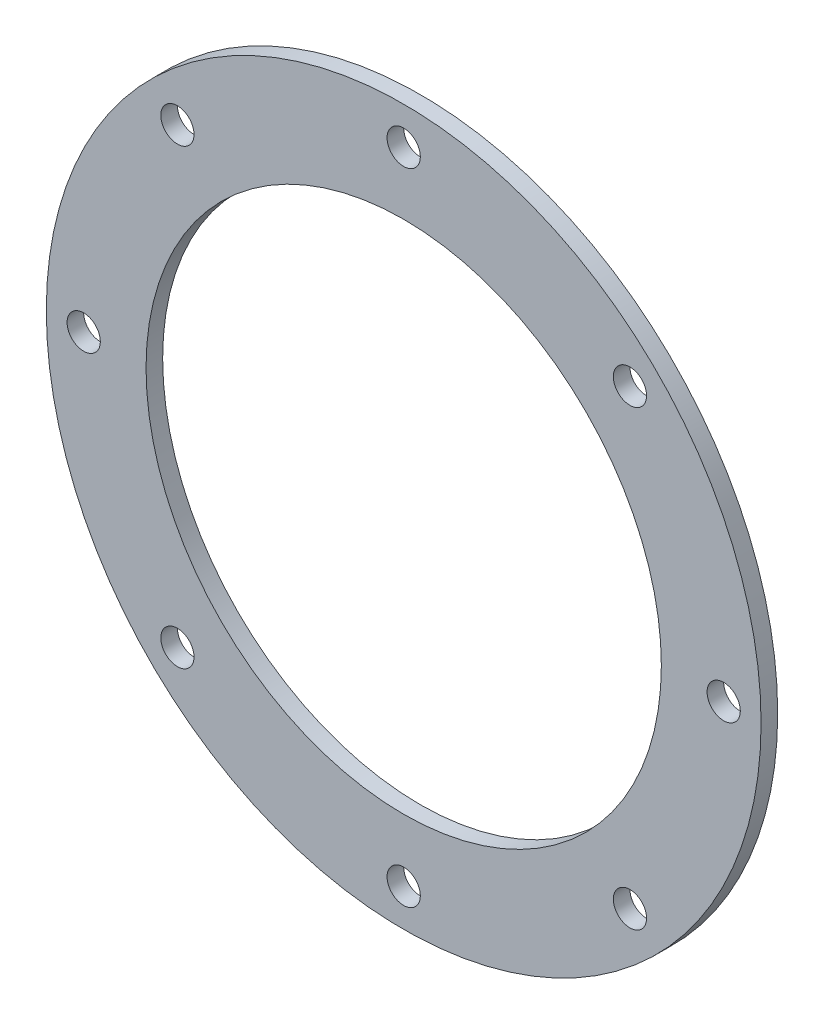
ISO-10303-21;
HEADER;
FILE_DESCRIPTION(('STEP AP214'),'2;1');
FILE_NAME('part.step','',(''),(''),'','','');
FILE_SCHEMA(('AUTOMOTIVE_DESIGN { 1 0 10303 214 1 1 1 1 }'));
ENDSEC;
DATA;
#1=APPLICATION_CONTEXT('core data for automotive mechanical design processes');
#2=APPLICATION_PROTOCOL_DEFINITION('international standard','automotive_design',2000,#1);
#3=PRODUCT_CONTEXT('',#1,'mechanical');
#4=PRODUCT('Part','Part','',(#3));
#5=PRODUCT_RELATED_PRODUCT_CATEGORY('part','',(#4));
#6=PRODUCT_DEFINITION_FORMATION('','',#4);
#7=PRODUCT_DEFINITION_CONTEXT('part definition',#1,'design');
#8=PRODUCT_DEFINITION('design','',#6,#7);
#9=PRODUCT_DEFINITION_SHAPE('','',#8);
#10=(LENGTH_UNIT() NAMED_UNIT(*) SI_UNIT(.MILLI.,.METRE.));
#11=(NAMED_UNIT(*) PLANE_ANGLE_UNIT() SI_UNIT($,.RADIAN.));
#12=(NAMED_UNIT(*) SI_UNIT($,.STERADIAN.) SOLID_ANGLE_UNIT());
#13=UNCERTAINTY_MEASURE_WITH_UNIT(LENGTH_MEASURE(1.E-05),#10,'distance_accuracy_value','');
#14=(GEOMETRIC_REPRESENTATION_CONTEXT(3) GLOBAL_UNCERTAINTY_ASSIGNED_CONTEXT((#13)) GLOBAL_UNIT_ASSIGNED_CONTEXT((#10,
#11,#12)) REPRESENTATION_CONTEXT('',''));
#15=CARTESIAN_POINT('',(0.,0.,0.));
#16=DIRECTION('',(0.,0.,1.));
#17=DIRECTION('',(1.,0.,0.));
#18=AXIS2_PLACEMENT_3D('',#15,#16,#17);
#19=CARTESIAN_POINT('',(0.,38.5,1.));
#20=DIRECTION('',(0.,0.,-1.));
#21=DIRECTION('',(-1.,0.,0.));
#22=AXIS2_PLACEMENT_3D('',#19,#20,#21);
#23=CYLINDRICAL_SURFACE('',#22,2.);
#24=CARTESIAN_POINT('',(0.,38.5,1.));
#25=DIRECTION('',(0.,0.,1.));
#26=DIRECTION('',(1.,0.,0.));
#27=AXIS2_PLACEMENT_3D('',#24,#25,#26);
#28=CIRCLE('',#27,2.);
#29=CARTESIAN_POINT('',(2.,38.5,1.));
#30=VERTEX_POINT('',#29);
#31=EDGE_CURVE('E49',#30,#30,#28,.T.);
#32=ORIENTED_EDGE('',*,*,#31,.T.);
#33=EDGE_LOOP('',(#32));
#34=FACE_BOUND('',#33,.T.);
#35=CARTESIAN_POINT('',(0.,38.5,-1.));
#36=DIRECTION('',(0.,0.,1.));
#37=DIRECTION('',(1.,0.,0.));
#38=AXIS2_PLACEMENT_3D('',#35,#36,#37);
#39=CIRCLE('',#38,2.);
#40=CARTESIAN_POINT('',(2.,38.5,-1.));
#41=VERTEX_POINT('',#40);
#42=EDGE_CURVE('E90',#41,#41,#39,.T.);
#43=ORIENTED_EDGE('',*,*,#42,.F.);
#44=EDGE_LOOP('',(#43));
#45=FACE_BOUND('',#44,.T.);
#46=ADVANCED_FACE('F40',(#34,#45),#23,.F.);
#47=CARTESIAN_POINT('',(27.2236110756821,27.2236110756821,1.));
#48=DIRECTION('',(0.,0.,-1.));
#49=DIRECTION('',(-1.,0.,0.));
#50=AXIS2_PLACEMENT_3D('',#47,#48,#49);
#51=CYLINDRICAL_SURFACE('',#50,2.);
#52=CARTESIAN_POINT('',(27.2236110756821,27.2236110756821,1.));
#53=DIRECTION('',(0.,0.,1.));
#54=DIRECTION('',(1.,0.,0.));
#55=AXIS2_PLACEMENT_3D('',#52,#53,#54);
#56=CIRCLE('',#55,2.);
#57=CARTESIAN_POINT('',(29.2236110756821,27.2236110756821,1.));
#58=VERTEX_POINT('',#57);
#59=EDGE_CURVE('E55',#58,#58,#56,.T.);
#60=ORIENTED_EDGE('',*,*,#59,.T.);
#61=EDGE_LOOP('',(#60));
#62=FACE_BOUND('',#61,.T.);
#63=CARTESIAN_POINT('',(27.2236110756821,27.2236110756821,-1.));
#64=DIRECTION('',(0.,0.,1.));
#65=DIRECTION('',(1.,0.,0.));
#66=AXIS2_PLACEMENT_3D('',#63,#64,#65);
#67=CIRCLE('',#66,2.);
#68=CARTESIAN_POINT('',(29.2236110756821,27.2236110756821,-1.));
#69=VERTEX_POINT('',#68);
#70=EDGE_CURVE('E87',#69,#69,#67,.T.);
#71=ORIENTED_EDGE('',*,*,#70,.F.);
#72=EDGE_LOOP('',(#71));
#73=FACE_BOUND('',#72,.T.);
#74=ADVANCED_FACE('F133',(#62,#73),#51,.F.);
#75=CARTESIAN_POINT('',(38.5,0.,1.));
#76=DIRECTION('',(0.,0.,-1.));
#77=DIRECTION('',(-1.,0.,0.));
#78=AXIS2_PLACEMENT_3D('',#75,#76,#77);
#79=CYLINDRICAL_SURFACE('',#78,2.);
#80=CARTESIAN_POINT('',(38.5,0.,1.));
#81=DIRECTION('',(0.,0.,1.));
#82=DIRECTION('',(1.,0.,0.));
#83=AXIS2_PLACEMENT_3D('',#80,#81,#82);
#84=CIRCLE('',#83,2.);
#85=CARTESIAN_POINT('',(40.5,0.,1.));
#86=VERTEX_POINT('',#85);
#87=EDGE_CURVE('E126',#86,#86,#84,.T.);
#88=ORIENTED_EDGE('',*,*,#87,.T.);
#89=EDGE_LOOP('',(#88));
#90=FACE_BOUND('',#89,.T.);
#91=CARTESIAN_POINT('',(38.5,0.,-1.));
#92=DIRECTION('',(0.,0.,1.));
#93=DIRECTION('',(1.,0.,0.));
#94=AXIS2_PLACEMENT_3D('',#91,#92,#93);
#95=CIRCLE('',#94,2.);
#96=CARTESIAN_POINT('',(40.5,0.,-1.));
#97=VERTEX_POINT('',#96);
#98=EDGE_CURVE('E83',#97,#97,#95,.T.);
#99=ORIENTED_EDGE('',*,*,#98,.F.);
#100=EDGE_LOOP('',(#99));
#101=FACE_BOUND('',#100,.T.);
#102=ADVANCED_FACE('F152',(#90,#101),#79,.F.);
#103=CARTESIAN_POINT('',(27.2236110756821,-27.2236110756821,1.));
#104=DIRECTION('',(0.,0.,-1.));
#105=DIRECTION('',(-1.,0.,0.));
#106=AXIS2_PLACEMENT_3D('',#103,#104,#105);
#107=CYLINDRICAL_SURFACE('',#106,2.);
#108=CARTESIAN_POINT('',(27.2236110756821,-27.2236110756821,1.));
#109=DIRECTION('',(0.,0.,1.));
#110=DIRECTION('',(1.,0.,0.));
#111=AXIS2_PLACEMENT_3D('',#108,#109,#110);
#112=CIRCLE('',#111,2.);
#113=CARTESIAN_POINT('',(29.2236110756821,-27.2236110756821,1.));
#114=VERTEX_POINT('',#113);
#115=EDGE_CURVE('E122',#114,#114,#112,.T.);
#116=ORIENTED_EDGE('',*,*,#115,.T.);
#117=EDGE_LOOP('',(#116));
#118=FACE_BOUND('',#117,.T.);
#119=CARTESIAN_POINT('',(27.2236110756821,-27.2236110756821,-1.));
#120=DIRECTION('',(0.,0.,1.));
#121=DIRECTION('',(1.,0.,0.));
#122=AXIS2_PLACEMENT_3D('',#119,#120,#121);
#123=CIRCLE('',#122,2.);
#124=CARTESIAN_POINT('',(29.2236110756821,-27.2236110756821,-1.));
#125=VERTEX_POINT('',#124);
#126=EDGE_CURVE('E79',#125,#125,#123,.T.);
#127=ORIENTED_EDGE('',*,*,#126,.F.);
#128=EDGE_LOOP('',(#127));
#129=FACE_BOUND('',#128,.T.);
#130=ADVANCED_FACE('F159',(#118,#129),#107,.F.);
#131=CARTESIAN_POINT('',(0.,-38.5,1.));
#132=DIRECTION('',(0.,0.,-1.));
#133=DIRECTION('',(-1.,0.,0.));
#134=AXIS2_PLACEMENT_3D('',#131,#132,#133);
#135=CYLINDRICAL_SURFACE('',#134,2.);
#136=CARTESIAN_POINT('',(0.,-38.5,1.));
#137=DIRECTION('',(0.,0.,1.));
#138=DIRECTION('',(1.,0.,0.));
#139=AXIS2_PLACEMENT_3D('',#136,#137,#138);
#140=CIRCLE('',#139,2.);
#141=CARTESIAN_POINT('',(2.00000000000001,-38.5,1.));
#142=VERTEX_POINT('',#141);
#143=EDGE_CURVE('E118',#142,#142,#140,.T.);
#144=ORIENTED_EDGE('',*,*,#143,.T.);
#145=EDGE_LOOP('',(#144));
#146=FACE_BOUND('',#145,.T.);
#147=CARTESIAN_POINT('',(0.,-38.5,-1.));
#148=DIRECTION('',(0.,0.,1.));
#149=DIRECTION('',(1.,0.,0.));
#150=AXIS2_PLACEMENT_3D('',#147,#148,#149);
#151=CIRCLE('',#150,2.);
#152=CARTESIAN_POINT('',(2.00000000000001,-38.5,-1.));
#153=VERTEX_POINT('',#152);
#154=EDGE_CURVE('E75',#153,#153,#151,.T.);
#155=ORIENTED_EDGE('',*,*,#154,.F.);
#156=EDGE_LOOP('',(#155));
#157=FACE_BOUND('',#156,.T.);
#158=ADVANCED_FACE('F163',(#146,#157),#135,.F.);
#159=CARTESIAN_POINT('',(-27.2236110756821,-27.2236110756821,1.));
#160=DIRECTION('',(0.,0.,-1.));
#161=DIRECTION('',(-1.,0.,0.));
#162=AXIS2_PLACEMENT_3D('',#159,#160,#161);
#163=CYLINDRICAL_SURFACE('',#162,2.00000000000001);
#164=CARTESIAN_POINT('',(-27.2236110756821,-27.2236110756821,1.));
#165=DIRECTION('',(0.,0.,1.));
#166=DIRECTION('',(1.,0.,0.));
#167=AXIS2_PLACEMENT_3D('',#164,#165,#166);
#168=CIRCLE('',#167,2.00000000000001);
#169=CARTESIAN_POINT('',(-25.2236110756821,-27.2236110756821,1.));
#170=VERTEX_POINT('',#169);
#171=EDGE_CURVE('E114',#170,#170,#168,.T.);
#172=ORIENTED_EDGE('',*,*,#171,.T.);
#173=EDGE_LOOP('',(#172));
#174=FACE_BOUND('',#173,.T.);
#175=CARTESIAN_POINT('',(-27.2236110756821,-27.2236110756821,-1.));
#176=DIRECTION('',(0.,0.,1.));
#177=DIRECTION('',(1.,0.,0.));
#178=AXIS2_PLACEMENT_3D('',#175,#176,#177);
#179=CIRCLE('',#178,2.00000000000001);
#180=CARTESIAN_POINT('',(-25.2236110756821,-27.2236110756821,-1.));
#181=VERTEX_POINT('',#180);
#182=EDGE_CURVE('E71',#181,#181,#179,.T.);
#183=ORIENTED_EDGE('',*,*,#182,.F.);
#184=EDGE_LOOP('',(#183));
#185=FACE_BOUND('',#184,.T.);
#186=ADVANCED_FACE('F167',(#174,#185),#163,.F.);
#187=CARTESIAN_POINT('',(-38.5,0.,1.));
#188=DIRECTION('',(0.,0.,-1.));
#189=DIRECTION('',(-1.,0.,0.));
#190=AXIS2_PLACEMENT_3D('',#187,#188,#189);
#191=CYLINDRICAL_SURFACE('',#190,2.);
#192=CARTESIAN_POINT('',(-38.5,0.,1.));
#193=DIRECTION('',(0.,0.,1.));
#194=DIRECTION('',(1.,0.,0.));
#195=AXIS2_PLACEMENT_3D('',#192,#193,#194);
#196=CIRCLE('',#195,2.);
#197=CARTESIAN_POINT('',(-36.5,0.,1.));
#198=VERTEX_POINT('',#197);
#199=EDGE_CURVE('E108',#198,#198,#196,.T.);
#200=ORIENTED_EDGE('',*,*,#199,.T.);
#201=EDGE_LOOP('',(#200));
#202=FACE_BOUND('',#201,.T.);
#203=CARTESIAN_POINT('',(-38.5,0.,-1.));
#204=DIRECTION('',(0.,0.,1.));
#205=DIRECTION('',(1.,0.,0.));
#206=AXIS2_PLACEMENT_3D('',#203,#204,#205);
#207=CIRCLE('',#206,2.);
#208=CARTESIAN_POINT('',(-36.5,0.,-1.));
#209=VERTEX_POINT('',#208);
#210=EDGE_CURVE('E67',#209,#209,#207,.T.);
#211=ORIENTED_EDGE('',*,*,#210,.F.);
#212=EDGE_LOOP('',(#211));
#213=FACE_BOUND('',#212,.T.);
#214=ADVANCED_FACE('F171',(#202,#213),#191,.F.);
#215=CARTESIAN_POINT('',(-27.2236110756821,27.2236110756821,1.));
#216=DIRECTION('',(0.,0.,-1.));
#217=DIRECTION('',(-1.,0.,0.));
#218=AXIS2_PLACEMENT_3D('',#215,#216,#217);
#219=CYLINDRICAL_SURFACE('',#218,2.00000000000001);
#220=CARTESIAN_POINT('',(-27.2236110756821,27.2236110756821,1.));
#221=DIRECTION('',(0.,0.,1.));
#222=DIRECTION('',(1.,0.,0.));
#223=AXIS2_PLACEMENT_3D('',#220,#221,#222);
#224=CIRCLE('',#223,2.00000000000001);
#225=CARTESIAN_POINT('',(-25.2236110756821,27.2236110756821,1.));
#226=VERTEX_POINT('',#225);
#227=EDGE_CURVE('E102',#226,#226,#224,.T.);
#228=ORIENTED_EDGE('',*,*,#227,.T.);
#229=EDGE_LOOP('',(#228));
#230=FACE_BOUND('',#229,.T.);
#231=CARTESIAN_POINT('',(-27.2236110756821,27.2236110756821,-1.));
#232=DIRECTION('',(0.,0.,1.));
#233=DIRECTION('',(1.,0.,0.));
#234=AXIS2_PLACEMENT_3D('',#231,#232,#233);
#235=CIRCLE('',#234,2.00000000000001);
#236=CARTESIAN_POINT('',(-25.2236110756821,27.2236110756821,-1.));
#237=VERTEX_POINT('',#236);
#238=EDGE_CURVE('E63',#237,#237,#235,.T.);
#239=ORIENTED_EDGE('',*,*,#238,.F.);
#240=EDGE_LOOP('',(#239));
#241=FACE_BOUND('',#240,.T.);
#242=ADVANCED_FACE('F174',(#230,#241),#219,.F.);
#243=CARTESIAN_POINT('',(0.,0.,1.));
#244=DIRECTION('',(0.,0.,-1.));
#245=DIRECTION('',(-1.,0.,0.));
#246=AXIS2_PLACEMENT_3D('',#243,#244,#245);
#247=CYLINDRICAL_SURFACE('',#246,43.);
#248=CARTESIAN_POINT('',(0.,0.,1.));
#249=DIRECTION('',(0.,0.,1.));
#250=DIRECTION('',(1.,0.,0.));
#251=AXIS2_PLACEMENT_3D('',#248,#249,#250);
#252=CIRCLE('',#251,43.);
#253=CARTESIAN_POINT('',(43.,0.,1.));
#254=VERTEX_POINT('',#253);
#255=EDGE_CURVE('E97',#254,#254,#252,.F.);
#256=ORIENTED_EDGE('',*,*,#255,.T.);
#257=EDGE_LOOP('',(#256));
#258=FACE_BOUND('',#257,.T.);
#259=CARTESIAN_POINT('',(0.,0.,-1.));
#260=DIRECTION('',(0.,0.,1.));
#261=DIRECTION('',(1.,0.,0.));
#262=AXIS2_PLACEMENT_3D('',#259,#260,#261);
#263=CIRCLE('',#262,43.);
#264=CARTESIAN_POINT('',(43.,0.,-1.));
#265=VERTEX_POINT('',#264);
#266=EDGE_CURVE('E59',#265,#265,#263,.F.);
#267=ORIENTED_EDGE('',*,*,#266,.F.);
#268=EDGE_LOOP('',(#267));
#269=FACE_BOUND('',#268,.T.);
#270=ADVANCED_FACE('F42',(#258,#269),#247,.T.);
#271=CARTESIAN_POINT('',(0.,0.,1.));
#272=DIRECTION('',(0.,0.,-1.));
#273=DIRECTION('',(-1.,0.,0.));
#274=AXIS2_PLACEMENT_3D('',#271,#272,#273);
#275=CYLINDRICAL_SURFACE('',#274,31.);
#276=CARTESIAN_POINT('',(0.,0.,1.));
#277=DIRECTION('',(0.,0.,1.));
#278=DIRECTION('',(1.,0.,0.));
#279=AXIS2_PLACEMENT_3D('',#276,#277,#278);
#280=CIRCLE('',#279,31.);
#281=CARTESIAN_POINT('',(31.,0.,1.));
#282=VERTEX_POINT('',#281);
#283=EDGE_CURVE('E10',#282,#282,#280,.T.);
#284=ORIENTED_EDGE('',*,*,#283,.T.);
#285=EDGE_LOOP('',(#284));
#286=FACE_BOUND('',#285,.T.);
#287=CARTESIAN_POINT('',(0.,0.,-1.));
#288=DIRECTION('',(0.,0.,1.));
#289=DIRECTION('',(1.,0.,0.));
#290=AXIS2_PLACEMENT_3D('',#287,#288,#289);
#291=CIRCLE('',#290,31.);
#292=CARTESIAN_POINT('',(31.,0.,-1.));
#293=VERTEX_POINT('',#292);
#294=EDGE_CURVE('E44',#293,#293,#291,.T.);
#295=ORIENTED_EDGE('',*,*,#294,.F.);
#296=EDGE_LOOP('',(#295));
#297=FACE_BOUND('',#296,.T.);
#298=ADVANCED_FACE('F140',(#286,#297),#275,.F.);
#299=CARTESIAN_POINT('',(0.,0.,1.));
#300=DIRECTION('',(0.,0.,1.));
#301=DIRECTION('',(1.,0.,0.));
#302=AXIS2_PLACEMENT_3D('',#299,#300,#301);
#303=PLANE('',#302);
#304=ORIENTED_EDGE('',*,*,#255,.F.);
#305=EDGE_LOOP('',(#304));
#306=FACE_BOUND('',#305,.T.);
#307=ORIENTED_EDGE('',*,*,#227,.F.);
#308=EDGE_LOOP('',(#307));
#309=FACE_BOUND('',#308,.T.);
#310=ORIENTED_EDGE('',*,*,#199,.F.);
#311=EDGE_LOOP('',(#310));
#312=FACE_BOUND('',#311,.T.);
#313=ORIENTED_EDGE('',*,*,#171,.F.);
#314=EDGE_LOOP('',(#313));
#315=FACE_BOUND('',#314,.T.);
#316=ORIENTED_EDGE('',*,*,#143,.F.);
#317=EDGE_LOOP('',(#316));
#318=FACE_BOUND('',#317,.T.);
#319=ORIENTED_EDGE('',*,*,#115,.F.);
#320=EDGE_LOOP('',(#319));
#321=FACE_BOUND('',#320,.T.);
#322=ORIENTED_EDGE('',*,*,#87,.F.);
#323=EDGE_LOOP('',(#322));
#324=FACE_BOUND('',#323,.T.);
#325=ORIENTED_EDGE('',*,*,#59,.F.);
#326=EDGE_LOOP('',(#325));
#327=FACE_BOUND('',#326,.T.);
#328=ORIENTED_EDGE('',*,*,#31,.F.);
#329=EDGE_LOOP('',(#328));
#330=FACE_BOUND('',#329,.T.);
#331=ORIENTED_EDGE('',*,*,#283,.F.);
#332=EDGE_LOOP('',(#331));
#333=FACE_BOUND('',#332,.T.);
#334=ADVANCED_FACE('F136',(#306,#309,#312,#315,#318,#321,#324,#327,#330,#333),#303,.T.);
#335=CARTESIAN_POINT('',(0.,0.,-1.));
#336=DIRECTION('',(0.,0.,1.));
#337=DIRECTION('',(1.,0.,0.));
#338=AXIS2_PLACEMENT_3D('',#335,#336,#337);
#339=PLANE('',#338);
#340=ORIENTED_EDGE('',*,*,#266,.T.);
#341=EDGE_LOOP('',(#340));
#342=FACE_BOUND('',#341,.T.);
#343=ORIENTED_EDGE('',*,*,#238,.T.);
#344=EDGE_LOOP('',(#343));
#345=FACE_BOUND('',#344,.T.);
#346=ORIENTED_EDGE('',*,*,#210,.T.);
#347=EDGE_LOOP('',(#346));
#348=FACE_BOUND('',#347,.T.);
#349=ORIENTED_EDGE('',*,*,#182,.T.);
#350=EDGE_LOOP('',(#349));
#351=FACE_BOUND('',#350,.T.);
#352=ORIENTED_EDGE('',*,*,#154,.T.);
#353=EDGE_LOOP('',(#352));
#354=FACE_BOUND('',#353,.T.);
#355=ORIENTED_EDGE('',*,*,#126,.T.);
#356=EDGE_LOOP('',(#355));
#357=FACE_BOUND('',#356,.T.);
#358=ORIENTED_EDGE('',*,*,#98,.T.);
#359=EDGE_LOOP('',(#358));
#360=FACE_BOUND('',#359,.T.);
#361=ORIENTED_EDGE('',*,*,#70,.T.);
#362=EDGE_LOOP('',(#361));
#363=FACE_BOUND('',#362,.T.);
#364=ORIENTED_EDGE('',*,*,#42,.T.);
#365=EDGE_LOOP('',(#364));
#366=FACE_BOUND('',#365,.T.);
#367=ORIENTED_EDGE('',*,*,#294,.T.);
#368=EDGE_LOOP('',(#367));
#369=FACE_BOUND('',#368,.T.);
#370=ADVANCED_FACE('F139',(#342,#345,#348,#351,#354,#357,#360,#363,#366,#369),#339,.F.);
#371=CLOSED_SHELL('',(#46,#74,#102,#130,#158,#186,#214,#242,#270,#298,#334,#370));
#372=MANIFOLD_SOLID_BREP('B2',#371);
#373=ADVANCED_BREP_SHAPE_REPRESENTATION('',(#18,#372),#14);
#374=SHAPE_DEFINITION_REPRESENTATION(#9,#373);
ENDSEC;
END-ISO-10303-21;
